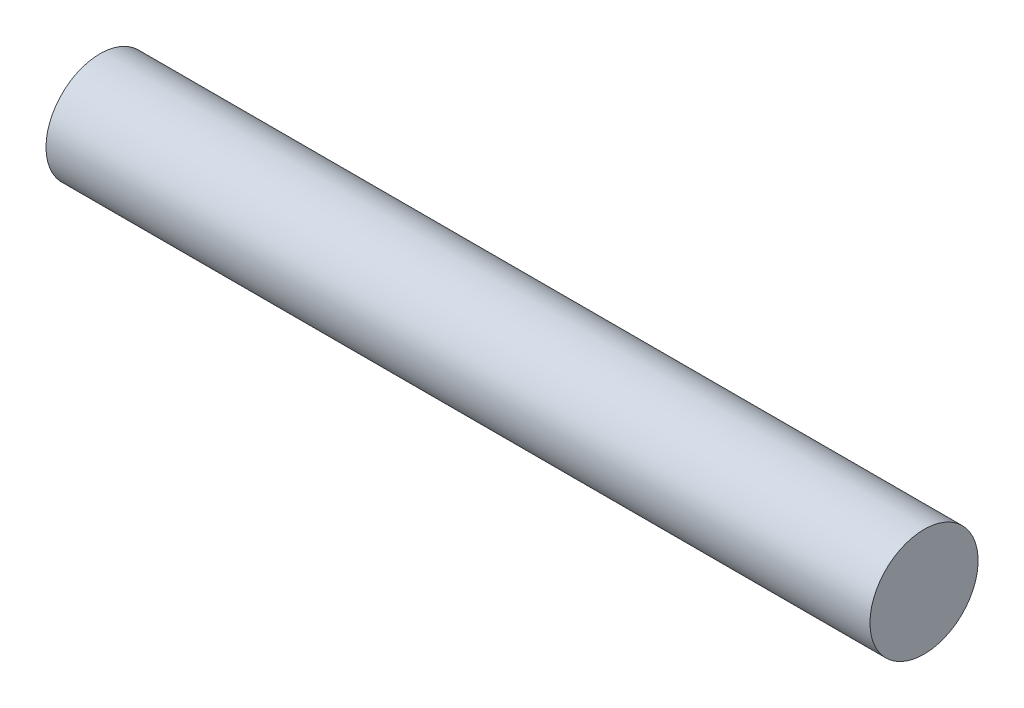
ISO-10303-21;
HEADER;
FILE_DESCRIPTION(('STEP AP214'),'2;1');
FILE_NAME('part.step','',(''),(''),'','','');
FILE_SCHEMA(('AUTOMOTIVE_DESIGN { 1 0 10303 214 1 1 1 1 }'));
ENDSEC;
DATA;
#1=APPLICATION_CONTEXT('core data for automotive mechanical design processes');
#2=APPLICATION_PROTOCOL_DEFINITION('international standard','automotive_design',2000,#1);
#3=PRODUCT_CONTEXT('',#1,'mechanical');
#4=PRODUCT('Part','Part','',(#3));
#5=PRODUCT_RELATED_PRODUCT_CATEGORY('part','',(#4));
#6=PRODUCT_DEFINITION_FORMATION('','',#4);
#7=PRODUCT_DEFINITION_CONTEXT('part definition',#1,'design');
#8=PRODUCT_DEFINITION('design','',#6,#7);
#9=PRODUCT_DEFINITION_SHAPE('','',#8);
#10=(LENGTH_UNIT() NAMED_UNIT(*) SI_UNIT(.MILLI.,.METRE.));
#11=(NAMED_UNIT(*) PLANE_ANGLE_UNIT() SI_UNIT($,.RADIAN.));
#12=(NAMED_UNIT(*) SI_UNIT($,.STERADIAN.) SOLID_ANGLE_UNIT());
#13=UNCERTAINTY_MEASURE_WITH_UNIT(LENGTH_MEASURE(1.E-05),#10,'distance_accuracy_value','');
#14=(GEOMETRIC_REPRESENTATION_CONTEXT(3) GLOBAL_UNCERTAINTY_ASSIGNED_CONTEXT((#13)) GLOBAL_UNIT_ASSIGNED_CONTEXT((#10,
#11,#12)) REPRESENTATION_CONTEXT('',''));
#15=CARTESIAN_POINT('',(0.,0.,0.));
#16=DIRECTION('',(0.,0.,1.));
#17=DIRECTION('',(1.,0.,0.));
#18=AXIS2_PLACEMENT_3D('',#15,#16,#17);
#19=CARTESIAN_POINT('',(76.2,0.,0.));
#20=DIRECTION('',(-1.,0.,0.));
#21=DIRECTION('',(0.,0.,1.));
#22=AXIS2_PLACEMENT_3D('',#19,#20,#21);
#23=CYLINDRICAL_SURFACE('',#22,5.);
#24=CARTESIAN_POINT('',(76.2,0.,0.));
#25=DIRECTION('',(1.,0.,0.));
#26=DIRECTION('',(0.,0.,-1.));
#27=AXIS2_PLACEMENT_3D('',#24,#25,#26);
#28=CIRCLE('',#27,5.);
#29=CARTESIAN_POINT('',(76.2,0.,5.));
#30=VERTEX_POINT('',#29);
#31=EDGE_CURVE('E10',#30,#30,#28,.T.);
#32=CARTESIAN_POINT('',(0.,0.,0.));
#33=DIRECTION('',(1.,0.,0.));
#34=DIRECTION('',(0.,0.,-1.));
#35=AXIS2_PLACEMENT_3D('',#32,#33,#34);
#36=CIRCLE('',#35,5.);
#37=CARTESIAN_POINT('',(0.,0.,5.));
#38=VERTEX_POINT('',#37);
#39=EDGE_CURVE('E34',#38,#38,#36,.T.);
#40=CARTESIAN_POINT('',(76.2,0.,5.));
#41=CARTESIAN_POINT('',(75.40625,0.,5.));
#42=CARTESIAN_POINT('',(74.6125,0.,5.));
#43=CARTESIAN_POINT('',(73.025,0.,5.));
#44=CARTESIAN_POINT('',(72.23125,0.,5.));
#45=CARTESIAN_POINT('',(70.64375,0.,5.));
#46=CARTESIAN_POINT('',(69.85,0.,5.));
#47=CARTESIAN_POINT('',(68.2625,0.,5.));
#48=CARTESIAN_POINT('',(67.46875,0.,5.));
#49=CARTESIAN_POINT('',(65.88125,0.,5.));
#50=CARTESIAN_POINT('',(65.0875,0.,5.));
#51=CARTESIAN_POINT('',(63.5,0.,5.));
#52=CARTESIAN_POINT('',(62.70625,0.,5.));
#53=CARTESIAN_POINT('',(61.11875,0.,5.));
#54=CARTESIAN_POINT('',(60.325,0.,5.));
#55=CARTESIAN_POINT('',(58.7375,0.,5.));
#56=CARTESIAN_POINT('',(57.94375,0.,5.));
#57=CARTESIAN_POINT('',(56.35625,0.,5.));
#58=CARTESIAN_POINT('',(55.5625,0.,5.));
#59=CARTESIAN_POINT('',(53.975,0.,5.));
#60=CARTESIAN_POINT('',(53.18125,0.,5.));
#61=CARTESIAN_POINT('',(51.59375,0.,5.));
#62=CARTESIAN_POINT('',(50.8,0.,5.));
#63=CARTESIAN_POINT('',(49.2125,0.,5.));
#64=CARTESIAN_POINT('',(48.41875,0.,5.));
#65=CARTESIAN_POINT('',(46.83125,0.,5.));
#66=CARTESIAN_POINT('',(46.0375,0.,5.));
#67=CARTESIAN_POINT('',(44.45,0.,5.));
#68=CARTESIAN_POINT('',(43.65625,0.,5.));
#69=CARTESIAN_POINT('',(42.06875,0.,5.));
#70=CARTESIAN_POINT('',(41.275,0.,5.));
#71=CARTESIAN_POINT('',(39.6875,0.,5.));
#72=CARTESIAN_POINT('',(38.89375,0.,5.));
#73=CARTESIAN_POINT('',(37.30625,0.,5.));
#74=CARTESIAN_POINT('',(36.5125,0.,5.));
#75=CARTESIAN_POINT('',(34.925,0.,5.));
#76=CARTESIAN_POINT('',(34.13125,0.,5.));
#77=CARTESIAN_POINT('',(32.54375,0.,5.));
#78=CARTESIAN_POINT('',(31.75,0.,5.));
#79=CARTESIAN_POINT('',(30.1625,0.,5.));
#80=CARTESIAN_POINT('',(29.36875,0.,5.));
#81=CARTESIAN_POINT('',(27.78125,0.,5.));
#82=CARTESIAN_POINT('',(26.9875,0.,5.));
#83=CARTESIAN_POINT('',(25.4,0.,5.));
#84=CARTESIAN_POINT('',(24.60625,0.,5.));
#85=CARTESIAN_POINT('',(23.01875,0.,5.));
#86=CARTESIAN_POINT('',(22.225,0.,5.));
#87=CARTESIAN_POINT('',(20.6375,0.,5.));
#88=CARTESIAN_POINT('',(19.84375,0.,5.));
#89=CARTESIAN_POINT('',(18.25625,0.,5.));
#90=CARTESIAN_POINT('',(17.4625,0.,5.));
#91=CARTESIAN_POINT('',(15.875,0.,5.));
#92=CARTESIAN_POINT('',(15.08125,0.,5.));
#93=CARTESIAN_POINT('',(13.49375,0.,5.));
#94=CARTESIAN_POINT('',(12.7,0.,5.));
#95=CARTESIAN_POINT('',(11.1125,0.,5.));
#96=CARTESIAN_POINT('',(10.31875,0.,5.));
#97=CARTESIAN_POINT('',(8.73125,0.,5.));
#98=CARTESIAN_POINT('',(7.93750000000001,0.,5.));
#99=CARTESIAN_POINT('',(6.35,0.,5.));
#100=CARTESIAN_POINT('',(5.55625,0.,5.));
#101=CARTESIAN_POINT('',(3.96875,0.,5.));
#102=CARTESIAN_POINT('',(3.175,0.,5.));
#103=CARTESIAN_POINT('',(1.5875,0.,5.));
#104=CARTESIAN_POINT('',(0.793750000000001,0.,5.));
#105=CARTESIAN_POINT('',(0.,0.,5.));
#106=B_SPLINE_CURVE_WITH_KNOTS('',3,(#40,#41,#42,#43,#44,#45,#46,#47,#48,#49,#50,#51,#52,#53,
#54,#55,#56,#57,#58,#59,#60,#61,#62,#63,#64,#65,#66,#67,#68,#69,#70,#71,#72,#73,#74,#75,#76,#77,
#78,#79,#80,#81,#82,#83,#84,#85,#86,#87,#88,#89,#90,#91,#92,#93,#94,#95,#96,#97,#98,#99,#100,
#101,#102,#103,#104,#105),.UNSPECIFIED.,.F.,.F.,(4,2,2,2,2,2,2,2,2,2,2,2,2,2,2,2,2,2,2,2,2,2,2,
2,2,2,2,2,2,2,2,2,4),(0.,2.38125,4.7625,7.14375,9.52500000000001,11.90625,14.2875,16.66875,
19.05,21.43125,23.8125,26.19375,28.575,30.95625,33.3375,35.71875,38.1,40.48125,42.8625,45.24375,
47.625,50.00625,52.3875,54.76875,57.15,59.53125,61.9125,64.29375,66.675,69.05625,71.4375,
73.81875,76.2),.UNSPECIFIED.);
#107=EDGE_CURVE('BSEAM31',#30,#38,#106,.T.);
#108=ORIENTED_EDGE('',*,*,#31,.F.);
#109=ORIENTED_EDGE('',*,*,#39,.T.);
#110=ORIENTED_EDGE('',*,*,#107,.T.);
#111=ORIENTED_EDGE('',*,*,#107,.F.);
#112=EDGE_LOOP('',(#108,#110,#109,#111));
#113=FACE_BOUND('',#112,.T.);
#114=ADVANCED_FACE('F31',(#113),#23,.T.);
#115=CARTESIAN_POINT('',(76.2,0.,0.));
#116=DIRECTION('',(1.,0.,0.));
#117=DIRECTION('',(0.,0.,-1.));
#118=AXIS2_PLACEMENT_3D('',#115,#116,#117);
#119=PLANE('',#118);
#120=ORIENTED_EDGE('',*,*,#31,.T.);
#121=EDGE_LOOP('',(#120));
#122=FACE_BOUND('',#121,.T.);
#123=ADVANCED_FACE('F46',(#122),#119,.T.);
#124=CARTESIAN_POINT('',(0.,0.,0.));
#125=DIRECTION('',(1.,0.,0.));
#126=DIRECTION('',(0.,0.,-1.));
#127=AXIS2_PLACEMENT_3D('',#124,#125,#126);
#128=PLANE('',#127);
#129=ORIENTED_EDGE('',*,*,#39,.F.);
#130=EDGE_LOOP('',(#129));
#131=FACE_BOUND('',#130,.T.);
#132=ADVANCED_FACE('F44',(#131),#128,.F.);
#133=CLOSED_SHELL('',(#114,#123,#132));
#134=MANIFOLD_SOLID_BREP('B2',#133);
#135=ADVANCED_BREP_SHAPE_REPRESENTATION('',(#18,#134),#14);
#136=SHAPE_DEFINITION_REPRESENTATION(#9,#135);
ENDSEC;
END-ISO-10303-21;
